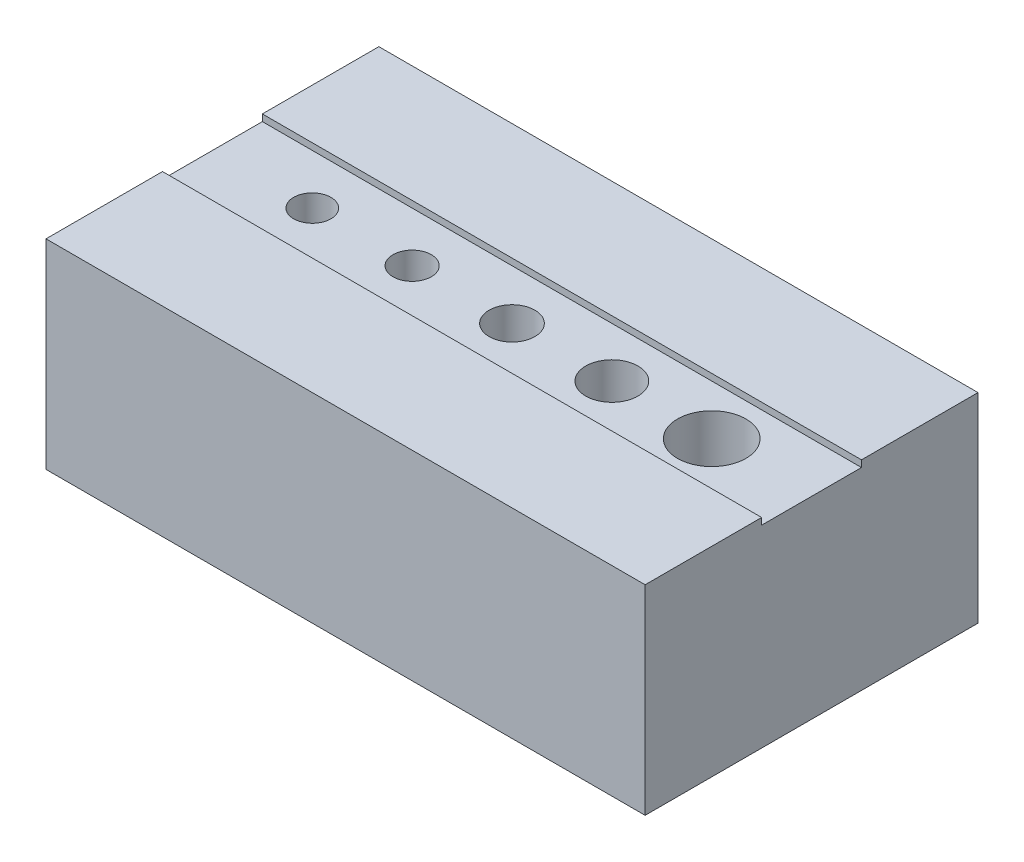
ISO-10303-21;
HEADER;
FILE_DESCRIPTION(('STEP AP214'),'2;1');
FILE_NAME('part.step','',(''),(''),'','','');
FILE_SCHEMA(('AUTOMOTIVE_DESIGN { 1 0 10303 214 1 1 1 1 }'));
ENDSEC;
DATA;
#1=APPLICATION_CONTEXT('core data for automotive mechanical design processes');
#2=APPLICATION_PROTOCOL_DEFINITION('international standard','automotive_design',2000,#1);
#3=PRODUCT_CONTEXT('',#1,'mechanical');
#4=PRODUCT('Part','Part','',(#3));
#5=PRODUCT_RELATED_PRODUCT_CATEGORY('part','',(#4));
#6=PRODUCT_DEFINITION_FORMATION('','',#4);
#7=PRODUCT_DEFINITION_CONTEXT('part definition',#1,'design');
#8=PRODUCT_DEFINITION('design','',#6,#7);
#9=PRODUCT_DEFINITION_SHAPE('','',#8);
#10=(LENGTH_UNIT() NAMED_UNIT(*) SI_UNIT(.MILLI.,.METRE.));
#11=(NAMED_UNIT(*) PLANE_ANGLE_UNIT() SI_UNIT($,.RADIAN.));
#12=(NAMED_UNIT(*) SI_UNIT($,.STERADIAN.) SOLID_ANGLE_UNIT());
#13=UNCERTAINTY_MEASURE_WITH_UNIT(LENGTH_MEASURE(1.E-05),#10,'distance_accuracy_value','');
#14=(GEOMETRIC_REPRESENTATION_CONTEXT(3) GLOBAL_UNCERTAINTY_ASSIGNED_CONTEXT((#13)) GLOBAL_UNIT_ASSIGNED_CONTEXT((#10,
#11,#12)) REPRESENTATION_CONTEXT('',''));
#15=CARTESIAN_POINT('',(0.,0.,0.));
#16=DIRECTION('',(0.,0.,1.));
#17=DIRECTION('',(1.,0.,0.));
#18=AXIS2_PLACEMENT_3D('',#15,#16,#17);
#19=CARTESIAN_POINT('',(0.,19.05,0.));
#20=DIRECTION('',(0.,-1.,0.));
#21=DIRECTION('',(0.,0.,-1.));
#22=AXIS2_PLACEMENT_3D('',#19,#20,#21);
#23=PLANE('',#22);
#24=DIRECTION('',(0.,0.,1.));
#25=VECTOR('',#24,1.);
#26=CARTESIAN_POINT('',(-28.575,19.05,15.875));
#27=LINE('',#26,#25);
#28=CARTESIAN_POINT('',(-28.575,19.05,-15.875));
#29=VERTEX_POINT('',#28);
#30=CARTESIAN_POINT('',(-28.575,19.05,-4.7625));
#31=VERTEX_POINT('',#30);
#32=EDGE_CURVE('E146',#29,#31,#27,.T.);
#33=ORIENTED_EDGE('',*,*,#32,.T.);
#34=DIRECTION('',(-1.,0.,0.));
#35=VECTOR('',#34,1.);
#36=CARTESIAN_POINT('',(-28.575,19.05,-4.7625));
#37=LINE('',#36,#35);
#38=CARTESIAN_POINT('',(28.575,19.05,-4.7625));
#39=VERTEX_POINT('',#38);
#40=EDGE_CURVE('E130',#39,#31,#37,.T.);
#41=ORIENTED_EDGE('',*,*,#40,.F.);
#42=DIRECTION('',(0.,0.,-1.));
#43=VECTOR('',#42,1.);
#44=CARTESIAN_POINT('',(28.575,19.05,15.875));
#45=LINE('',#44,#43);
#46=CARTESIAN_POINT('',(28.575,19.05,-15.875));
#47=VERTEX_POINT('',#46);
#48=EDGE_CURVE('E92',#39,#47,#45,.T.);
#49=ORIENTED_EDGE('',*,*,#48,.T.);
#50=DIRECTION('',(-1.,0.,0.));
#51=VECTOR('',#50,1.);
#52=CARTESIAN_POINT('',(-28.575,19.05,-15.875));
#53=LINE('',#52,#51);
#54=EDGE_CURVE('E144',#47,#29,#53,.T.);
#55=ORIENTED_EDGE('',*,*,#54,.T.);
#56=EDGE_LOOP('',(#33,#41,#49,#55));
#57=FACE_BOUND('',#56,.T.);
#58=ADVANCED_FACE('F39',(#57),#23,.F.);
#59=CARTESIAN_POINT('',(28.575,19.05,15.875));
#60=DIRECTION('',(-1.,0.,0.));
#61=DIRECTION('',(0.,0.,1.));
#62=AXIS2_PLACEMENT_3D('',#59,#60,#61);
#63=PLANE('',#62);
#64=ORIENTED_EDGE('',*,*,#48,.F.);
#65=DIRECTION('',(0.,1.,0.));
#66=VECTOR('',#65,1.);
#67=CARTESIAN_POINT('',(28.575,18.415,-4.7625));
#68=LINE('',#67,#66);
#69=CARTESIAN_POINT('',(28.575,18.415,-4.7625));
#70=VERTEX_POINT('',#69);
#71=EDGE_CURVE('E137',#70,#39,#68,.T.);
#72=ORIENTED_EDGE('',*,*,#71,.F.);
#73=DIRECTION('',(0.,0.,-1.));
#74=VECTOR('',#73,1.);
#75=CARTESIAN_POINT('',(28.575,18.415,-4.7625));
#76=LINE('',#75,#74);
#77=CARTESIAN_POINT('',(28.575,18.415,4.7625));
#78=VERTEX_POINT('',#77);
#79=EDGE_CURVE('E120',#78,#70,#76,.T.);
#80=ORIENTED_EDGE('',*,*,#79,.F.);
#81=DIRECTION('',(0.,1.,0.));
#82=VECTOR('',#81,1.);
#83=CARTESIAN_POINT('',(28.575,18.415,4.7625));
#84=LINE('',#83,#82);
#85=CARTESIAN_POINT('',(28.575,19.05,4.7625));
#86=VERTEX_POINT('',#85);
#87=EDGE_CURVE('E117',#78,#86,#84,.T.);
#88=ORIENTED_EDGE('',*,*,#87,.T.);
#89=CARTESIAN_POINT('',(28.575,19.05,15.875));
#90=VERTEX_POINT('',#89);
#91=EDGE_CURVE('E142',#90,#86,#45,.T.);
#92=ORIENTED_EDGE('',*,*,#91,.F.);
#93=DIRECTION('',(0.,-1.,0.));
#94=VECTOR('',#93,1.);
#95=CARTESIAN_POINT('',(28.575,19.05,15.875));
#96=LINE('',#95,#94);
#97=CARTESIAN_POINT('',(28.575,0.,15.875));
#98=VERTEX_POINT('',#97);
#99=EDGE_CURVE('E150',#90,#98,#96,.T.);
#100=ORIENTED_EDGE('',*,*,#99,.T.);
#101=DIRECTION('',(0.,0.,-1.));
#102=VECTOR('',#101,1.);
#103=CARTESIAN_POINT('',(28.575,0.,15.875));
#104=LINE('',#103,#102);
#105=CARTESIAN_POINT('',(28.575,0.,-15.875));
#106=VERTEX_POINT('',#105);
#107=EDGE_CURVE('E151',#98,#106,#104,.T.);
#108=ORIENTED_EDGE('',*,*,#107,.T.);
#109=DIRECTION('',(0.,-1.,0.));
#110=VECTOR('',#109,1.);
#111=CARTESIAN_POINT('',(28.575,19.05,-15.875));
#112=LINE('',#111,#110);
#113=EDGE_CURVE('E11',#47,#106,#112,.T.);
#114=ORIENTED_EDGE('',*,*,#113,.F.);
#115=EDGE_LOOP('',(#64,#72,#80,#88,#92,#100,#108,#114));
#116=FACE_BOUND('',#115,.T.);
#117=ADVANCED_FACE('F41',(#116),#63,.F.);
#118=CARTESIAN_POINT('',(-28.575,19.05,-15.875));
#119=DIRECTION('',(0.,0.,1.));
#120=DIRECTION('',(1.,0.,0.));
#121=AXIS2_PLACEMENT_3D('',#118,#119,#120);
#122=PLANE('',#121);
#123=DIRECTION('',(-1.,0.,0.));
#124=VECTOR('',#123,1.);
#125=CARTESIAN_POINT('',(-28.575,0.,-15.875));
#126=LINE('',#125,#124);
#127=CARTESIAN_POINT('',(-28.575,0.,-15.875));
#128=VERTEX_POINT('',#127);
#129=EDGE_CURVE('E154',#106,#128,#126,.T.);
#130=ORIENTED_EDGE('',*,*,#129,.T.);
#131=DIRECTION('',(0.,-1.,0.));
#132=VECTOR('',#131,1.);
#133=CARTESIAN_POINT('',(-28.575,19.05,-15.875));
#134=LINE('',#133,#132);
#135=EDGE_CURVE('E47',#29,#128,#134,.T.);
#136=ORIENTED_EDGE('',*,*,#135,.F.);
#137=ORIENTED_EDGE('',*,*,#54,.F.);
#138=ORIENTED_EDGE('',*,*,#113,.T.);
#139=EDGE_LOOP('',(#130,#136,#137,#138));
#140=FACE_BOUND('',#139,.T.);
#141=ADVANCED_FACE('F184',(#140),#122,.F.);
#142=CARTESIAN_POINT('',(-28.575,19.05,15.875));
#143=DIRECTION('',(1.,0.,0.));
#144=DIRECTION('',(0.,0.,-1.));
#145=AXIS2_PLACEMENT_3D('',#142,#143,#144);
#146=PLANE('',#145);
#147=DIRECTION('',(0.,0.,1.));
#148=VECTOR('',#147,1.);
#149=CARTESIAN_POINT('',(-28.575,18.415,-4.7625));
#150=LINE('',#149,#148);
#151=CARTESIAN_POINT('',(-28.575,18.415,-4.7625));
#152=VERTEX_POINT('',#151);
#153=CARTESIAN_POINT('',(-28.575,18.415,4.7625));
#154=VERTEX_POINT('',#153);
#155=EDGE_CURVE('E121',#152,#154,#150,.T.);
#156=ORIENTED_EDGE('',*,*,#155,.F.);
#157=DIRECTION('',(0.,1.,0.));
#158=VECTOR('',#157,1.);
#159=CARTESIAN_POINT('',(-28.575,18.415,-4.7625));
#160=LINE('',#159,#158);
#161=EDGE_CURVE('E155',#152,#31,#160,.T.);
#162=ORIENTED_EDGE('',*,*,#161,.T.);
#163=ORIENTED_EDGE('',*,*,#32,.F.);
#164=ORIENTED_EDGE('',*,*,#135,.T.);
#165=DIRECTION('',(0.,0.,1.));
#166=VECTOR('',#165,1.);
#167=CARTESIAN_POINT('',(-28.575,0.,15.875));
#168=LINE('',#167,#166);
#169=CARTESIAN_POINT('',(-28.575,0.,15.875));
#170=VERTEX_POINT('',#169);
#171=EDGE_CURVE('E157',#128,#170,#168,.T.);
#172=ORIENTED_EDGE('',*,*,#171,.T.);
#173=DIRECTION('',(0.,-1.,0.));
#174=VECTOR('',#173,1.);
#175=CARTESIAN_POINT('',(-28.575,19.05,15.875));
#176=LINE('',#175,#174);
#177=CARTESIAN_POINT('',(-28.575,19.05,15.875));
#178=VERTEX_POINT('',#177);
#179=EDGE_CURVE('E161',#178,#170,#176,.T.);
#180=ORIENTED_EDGE('',*,*,#179,.F.);
#181=CARTESIAN_POINT('',(-28.575,19.05,4.7625));
#182=VERTEX_POINT('',#181);
#183=EDGE_CURVE('E135',#182,#178,#27,.T.);
#184=ORIENTED_EDGE('',*,*,#183,.F.);
#185=DIRECTION('',(0.,1.,0.));
#186=VECTOR('',#185,1.);
#187=CARTESIAN_POINT('',(-28.575,18.415,4.7625));
#188=LINE('',#187,#186);
#189=EDGE_CURVE('E54',#154,#182,#188,.T.);
#190=ORIENTED_EDGE('',*,*,#189,.F.);
#191=EDGE_LOOP('',(#156,#162,#163,#164,#172,#180,#184,#190));
#192=FACE_BOUND('',#191,.T.);
#193=ADVANCED_FACE('F133',(#192),#146,.F.);
#194=CARTESIAN_POINT('',(-28.575,19.05,15.875));
#195=DIRECTION('',(0.,0.,-1.));
#196=DIRECTION('',(-1.,0.,0.));
#197=AXIS2_PLACEMENT_3D('',#194,#195,#196);
#198=PLANE('',#197);
#199=DIRECTION('',(1.,0.,0.));
#200=VECTOR('',#199,1.);
#201=CARTESIAN_POINT('',(-28.575,0.,15.875));
#202=LINE('',#201,#200);
#203=EDGE_CURVE('E84',#170,#98,#202,.T.);
#204=ORIENTED_EDGE('',*,*,#203,.T.);
#205=ORIENTED_EDGE('',*,*,#99,.F.);
#206=DIRECTION('',(1.,0.,0.));
#207=VECTOR('',#206,1.);
#208=CARTESIAN_POINT('',(-28.575,19.05,15.875));
#209=LINE('',#208,#207);
#210=EDGE_CURVE('E63',#178,#90,#209,.T.);
#211=ORIENTED_EDGE('',*,*,#210,.F.);
#212=ORIENTED_EDGE('',*,*,#179,.T.);
#213=EDGE_LOOP('',(#204,#205,#211,#212));
#214=FACE_BOUND('',#213,.T.);
#215=ADVANCED_FACE('F173',(#214),#198,.F.);
#216=ORIENTED_EDGE('',*,*,#91,.T.);
#217=DIRECTION('',(1.,0.,0.));
#218=VECTOR('',#217,1.);
#219=CARTESIAN_POINT('',(-28.575,19.05,4.7625));
#220=LINE('',#219,#218);
#221=EDGE_CURVE('E228',#182,#86,#220,.T.);
#222=ORIENTED_EDGE('',*,*,#221,.F.);
#223=ORIENTED_EDGE('',*,*,#183,.T.);
#224=ORIENTED_EDGE('',*,*,#210,.T.);
#225=EDGE_LOOP('',(#216,#222,#223,#224));
#226=FACE_BOUND('',#225,.T.);
#227=ADVANCED_FACE('F175',(#226),#23,.F.);
#228=CARTESIAN_POINT('',(0.,0.,0.));
#229=DIRECTION('',(0.,-1.,0.));
#230=DIRECTION('',(0.,0.,-1.));
#231=AXIS2_PLACEMENT_3D('',#228,#229,#230);
#232=PLANE('',#231);
#233=CARTESIAN_POINT('',(-19.05,0.,0.));
#234=DIRECTION('',(0.,1.,0.));
#235=DIRECTION('',(0.,0.,1.));
#236=AXIS2_PLACEMENT_3D('',#233,#234,#235);
#237=CIRCLE('',#236,1.778);
#238=CARTESIAN_POINT('',(-19.05,0.,1.778));
#239=VERTEX_POINT('',#238);
#240=EDGE_CURVE('E204',#239,#239,#237,.T.);
#241=ORIENTED_EDGE('',*,*,#240,.T.);
#242=EDGE_LOOP('',(#241));
#243=FACE_BOUND('',#242,.T.);
#244=CARTESIAN_POINT('',(-9.52499999999999,0.,0.));
#245=DIRECTION('',(0.,1.,0.));
#246=DIRECTION('',(0.,0.,1.));
#247=AXIS2_PLACEMENT_3D('',#244,#245,#246);
#248=CIRCLE('',#247,1.8288);
#249=CARTESIAN_POINT('',(-9.52499999999999,0.,1.8288));
#250=VERTEX_POINT('',#249);
#251=EDGE_CURVE('E208',#250,#250,#248,.T.);
#252=ORIENTED_EDGE('',*,*,#251,.T.);
#253=EDGE_LOOP('',(#252));
#254=FACE_BOUND('',#253,.T.);
#255=CARTESIAN_POINT('',(0.,0.,0.));
#256=DIRECTION('',(0.,1.,0.));
#257=DIRECTION('',(0.,0.,1.));
#258=AXIS2_PLACEMENT_3D('',#255,#256,#257);
#259=CIRCLE('',#258,2.1844);
#260=CARTESIAN_POINT('',(0.,0.,2.1844));
#261=VERTEX_POINT('',#260);
#262=EDGE_CURVE('E212',#261,#261,#259,.T.);
#263=ORIENTED_EDGE('',*,*,#262,.T.);
#264=EDGE_LOOP('',(#263));
#265=FACE_BOUND('',#264,.T.);
#266=CARTESIAN_POINT('',(9.52500000000001,0.,0.));
#267=DIRECTION('',(0.,1.,0.));
#268=DIRECTION('',(0.,0.,1.));
#269=AXIS2_PLACEMENT_3D('',#266,#267,#268);
#270=CIRCLE('',#269,2.4892);
#271=CARTESIAN_POINT('',(9.52500000000001,0.,2.4892));
#272=VERTEX_POINT('',#271);
#273=EDGE_CURVE('E216',#272,#272,#270,.T.);
#274=ORIENTED_EDGE('',*,*,#273,.T.);
#275=EDGE_LOOP('',(#274));
#276=FACE_BOUND('',#275,.T.);
#277=CARTESIAN_POINT('',(19.05,0.,0.));
#278=DIRECTION('',(0.,1.,0.));
#279=DIRECTION('',(0.,0.,1.));
#280=AXIS2_PLACEMENT_3D('',#277,#278,#279);
#281=CIRCLE('',#280,3.2639);
#282=CARTESIAN_POINT('',(19.05,0.,3.2639));
#283=VERTEX_POINT('',#282);
#284=EDGE_CURVE('E219',#283,#283,#281,.T.);
#285=ORIENTED_EDGE('',*,*,#284,.T.);
#286=EDGE_LOOP('',(#285));
#287=FACE_BOUND('',#286,.T.);
#288=ORIENTED_EDGE('',*,*,#107,.F.);
#289=ORIENTED_EDGE('',*,*,#203,.F.);
#290=ORIENTED_EDGE('',*,*,#171,.F.);
#291=ORIENTED_EDGE('',*,*,#129,.F.);
#292=EDGE_LOOP('',(#288,#289,#290,#291));
#293=FACE_BOUND('',#292,.T.);
#294=ADVANCED_FACE('F169',(#243,#254,#265,#276,#287,#293),#232,.T.);
#295=CARTESIAN_POINT('',(-28.575,18.415,-4.7625));
#296=DIRECTION('',(0.,0.,-1.));
#297=DIRECTION('',(-1.,0.,0.));
#298=AXIS2_PLACEMENT_3D('',#295,#296,#297);
#299=PLANE('',#298);
#300=ORIENTED_EDGE('',*,*,#40,.T.);
#301=ORIENTED_EDGE('',*,*,#161,.F.);
#302=DIRECTION('',(-1.,0.,0.));
#303=VECTOR('',#302,1.);
#304=CARTESIAN_POINT('',(-28.575,18.415,-4.7625));
#305=LINE('',#304,#303);
#306=EDGE_CURVE('E127',#70,#152,#305,.T.);
#307=ORIENTED_EDGE('',*,*,#306,.F.);
#308=ORIENTED_EDGE('',*,*,#71,.T.);
#309=EDGE_LOOP('',(#300,#301,#307,#308));
#310=FACE_BOUND('',#309,.T.);
#311=ADVANCED_FACE('F193',(#310),#299,.F.);
#312=CARTESIAN_POINT('',(-28.575,18.415,4.7625));
#313=DIRECTION('',(0.,0.,1.));
#314=DIRECTION('',(1.,0.,0.));
#315=AXIS2_PLACEMENT_3D('',#312,#313,#314);
#316=PLANE('',#315);
#317=ORIENTED_EDGE('',*,*,#221,.T.);
#318=ORIENTED_EDGE('',*,*,#87,.F.);
#319=DIRECTION('',(1.,0.,0.));
#320=VECTOR('',#319,1.);
#321=CARTESIAN_POINT('',(-28.575,18.415,4.7625));
#322=LINE('',#321,#320);
#323=EDGE_CURVE('E113',#154,#78,#322,.T.);
#324=ORIENTED_EDGE('',*,*,#323,.F.);
#325=ORIENTED_EDGE('',*,*,#189,.T.);
#326=EDGE_LOOP('',(#317,#318,#324,#325));
#327=FACE_BOUND('',#326,.T.);
#328=ADVANCED_FACE('F115',(#327),#316,.F.);
#329=CARTESIAN_POINT('',(0.,18.415,0.));
#330=DIRECTION('',(0.,1.,0.));
#331=DIRECTION('',(0.,0.,1.));
#332=AXIS2_PLACEMENT_3D('',#329,#330,#331);
#333=PLANE('',#332);
#334=CARTESIAN_POINT('',(-19.05,18.415,0.));
#335=DIRECTION('',(0.,1.,0.));
#336=DIRECTION('',(0.,0.,1.));
#337=AXIS2_PLACEMENT_3D('',#334,#335,#336);
#338=CIRCLE('',#337,1.778);
#339=CARTESIAN_POINT('',(-19.05,18.415,1.778));
#340=VERTEX_POINT('',#339);
#341=EDGE_CURVE('E338',#340,#340,#338,.T.);
#342=ORIENTED_EDGE('',*,*,#341,.F.);
#343=EDGE_LOOP('',(#342));
#344=FACE_BOUND('',#343,.T.);
#345=CARTESIAN_POINT('',(-9.52499999999999,18.415,0.));
#346=DIRECTION('',(0.,1.,0.));
#347=DIRECTION('',(0.,0.,1.));
#348=AXIS2_PLACEMENT_3D('',#345,#346,#347);
#349=CIRCLE('',#348,1.8288);
#350=CARTESIAN_POINT('',(-9.52499999999999,18.415,1.8288));
#351=VERTEX_POINT('',#350);
#352=EDGE_CURVE('E339',#351,#351,#349,.T.);
#353=ORIENTED_EDGE('',*,*,#352,.F.);
#354=EDGE_LOOP('',(#353));
#355=FACE_BOUND('',#354,.T.);
#356=CARTESIAN_POINT('',(0.,18.415,0.));
#357=DIRECTION('',(0.,1.,0.));
#358=DIRECTION('',(0.,0.,1.));
#359=AXIS2_PLACEMENT_3D('',#356,#357,#358);
#360=CIRCLE('',#359,2.1844);
#361=CARTESIAN_POINT('',(0.,18.415,2.1844));
#362=VERTEX_POINT('',#361);
#363=EDGE_CURVE('E346',#362,#362,#360,.T.);
#364=ORIENTED_EDGE('',*,*,#363,.F.);
#365=EDGE_LOOP('',(#364));
#366=FACE_BOUND('',#365,.T.);
#367=CARTESIAN_POINT('',(9.52500000000001,18.415,0.));
#368=DIRECTION('',(0.,1.,0.));
#369=DIRECTION('',(0.,0.,1.));
#370=AXIS2_PLACEMENT_3D('',#367,#368,#369);
#371=CIRCLE('',#370,2.4892);
#372=CARTESIAN_POINT('',(9.52500000000001,18.415,2.4892));
#373=VERTEX_POINT('',#372);
#374=EDGE_CURVE('E350',#373,#373,#371,.T.);
#375=ORIENTED_EDGE('',*,*,#374,.F.);
#376=EDGE_LOOP('',(#375));
#377=FACE_BOUND('',#376,.T.);
#378=CARTESIAN_POINT('',(19.05,18.415,0.));
#379=DIRECTION('',(0.,1.,0.));
#380=DIRECTION('',(0.,0.,1.));
#381=AXIS2_PLACEMENT_3D('',#378,#379,#380);
#382=CIRCLE('',#381,3.2639);
#383=CARTESIAN_POINT('',(19.05,18.415,3.2639));
#384=VERTEX_POINT('',#383);
#385=EDGE_CURVE('E221',#384,#384,#382,.T.);
#386=ORIENTED_EDGE('',*,*,#385,.F.);
#387=EDGE_LOOP('',(#386));
#388=FACE_BOUND('',#387,.T.);
#389=ORIENTED_EDGE('',*,*,#155,.T.);
#390=ORIENTED_EDGE('',*,*,#323,.T.);
#391=ORIENTED_EDGE('',*,*,#79,.T.);
#392=ORIENTED_EDGE('',*,*,#306,.T.);
#393=EDGE_LOOP('',(#389,#390,#391,#392));
#394=FACE_BOUND('',#393,.T.);
#395=ADVANCED_FACE('F125',(#344,#355,#366,#377,#388,#394),#333,.T.);
#396=CARTESIAN_POINT('',(19.05,0.,0.));
#397=DIRECTION('',(0.,1.,0.));
#398=DIRECTION('',(0.,0.,1.));
#399=AXIS2_PLACEMENT_3D('',#396,#397,#398);
#400=CYLINDRICAL_SURFACE('',#399,3.2639);
#401=ORIENTED_EDGE('',*,*,#284,.F.);
#402=EDGE_LOOP('',(#401));
#403=FACE_BOUND('',#402,.T.);
#404=ORIENTED_EDGE('',*,*,#385,.T.);
#405=EDGE_LOOP('',(#404));
#406=FACE_BOUND('',#405,.T.);
#407=ADVANCED_FACE('F283',(#403,#406),#400,.F.);
#408=CARTESIAN_POINT('',(9.52500000000001,0.,0.));
#409=DIRECTION('',(0.,1.,0.));
#410=DIRECTION('',(0.,0.,1.));
#411=AXIS2_PLACEMENT_3D('',#408,#409,#410);
#412=CYLINDRICAL_SURFACE('',#411,2.4892);
#413=ORIENTED_EDGE('',*,*,#273,.F.);
#414=EDGE_LOOP('',(#413));
#415=FACE_BOUND('',#414,.T.);
#416=ORIENTED_EDGE('',*,*,#374,.T.);
#417=EDGE_LOOP('',(#416));
#418=FACE_BOUND('',#417,.T.);
#419=ADVANCED_FACE('F293',(#415,#418),#412,.F.);
#420=CARTESIAN_POINT('',(0.,0.,0.));
#421=DIRECTION('',(0.,1.,0.));
#422=DIRECTION('',(0.,0.,1.));
#423=AXIS2_PLACEMENT_3D('',#420,#421,#422);
#424=CYLINDRICAL_SURFACE('',#423,2.1844);
#425=ORIENTED_EDGE('',*,*,#262,.F.);
#426=EDGE_LOOP('',(#425));
#427=FACE_BOUND('',#426,.T.);
#428=ORIENTED_EDGE('',*,*,#363,.T.);
#429=EDGE_LOOP('',(#428));
#430=FACE_BOUND('',#429,.T.);
#431=ADVANCED_FACE('F302',(#427,#430),#424,.F.);
#432=CARTESIAN_POINT('',(-9.52499999999999,0.,0.));
#433=DIRECTION('',(0.,1.,0.));
#434=DIRECTION('',(0.,0.,1.));
#435=AXIS2_PLACEMENT_3D('',#432,#433,#434);
#436=CYLINDRICAL_SURFACE('',#435,1.8288);
#437=ORIENTED_EDGE('',*,*,#251,.F.);
#438=EDGE_LOOP('',(#437));
#439=FACE_BOUND('',#438,.T.);
#440=ORIENTED_EDGE('',*,*,#352,.T.);
#441=EDGE_LOOP('',(#440));
#442=FACE_BOUND('',#441,.T.);
#443=ADVANCED_FACE('F312',(#439,#442),#436,.F.);
#444=CARTESIAN_POINT('',(-19.05,0.,0.));
#445=DIRECTION('',(0.,1.,0.));
#446=DIRECTION('',(0.,0.,1.));
#447=AXIS2_PLACEMENT_3D('',#444,#445,#446);
#448=CYLINDRICAL_SURFACE('',#447,1.778);
#449=ORIENTED_EDGE('',*,*,#240,.F.);
#450=EDGE_LOOP('',(#449));
#451=FACE_BOUND('',#450,.T.);
#452=ORIENTED_EDGE('',*,*,#341,.T.);
#453=EDGE_LOOP('',(#452));
#454=FACE_BOUND('',#453,.T.);
#455=ADVANCED_FACE('F322',(#451,#454),#448,.F.);
#456=CLOSED_SHELL('',(#58,#117,#141,#193,#215,#227,#294,#311,#328,#395,#407,#419,#431,#443,#455));
#457=MANIFOLD_SOLID_BREP('B2',#456);
#458=ADVANCED_BREP_SHAPE_REPRESENTATION('',(#18,#457),#14);
#459=SHAPE_DEFINITION_REPRESENTATION(#9,#458);
ENDSEC;
END-ISO-10303-21;
